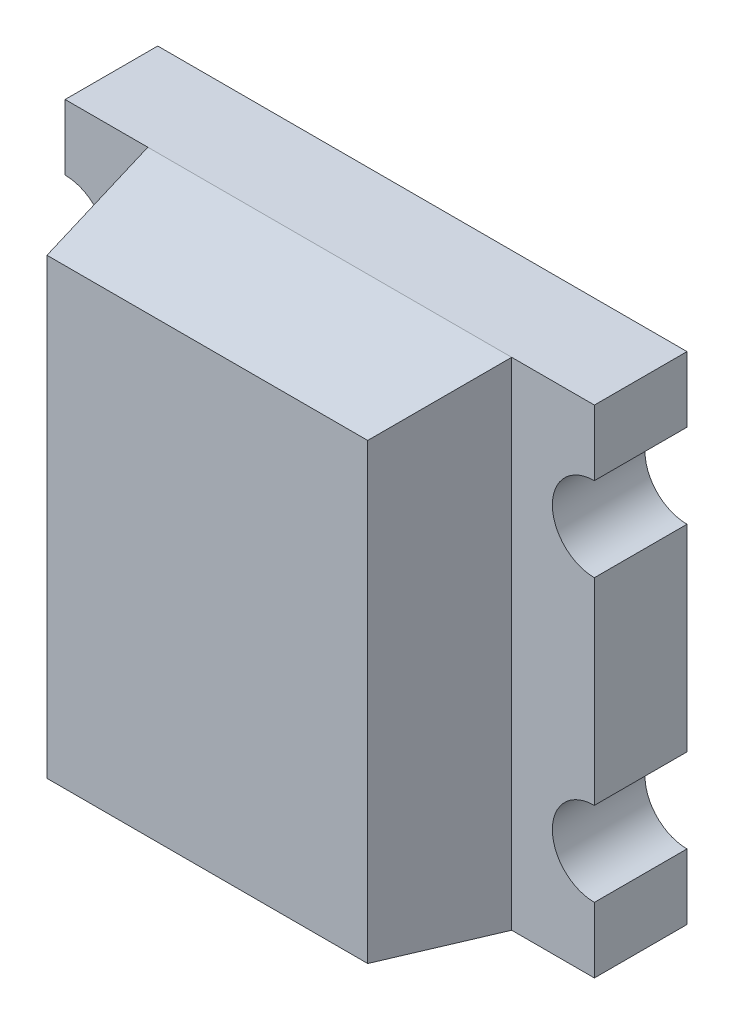
ISO-10303-21;
HEADER;
FILE_DESCRIPTION(('STEP AP214'),'2;1');
FILE_NAME('part.step','',(''),(''),'','','');
FILE_SCHEMA(('AUTOMOTIVE_DESIGN { 1 0 10303 214 1 1 1 1 }'));
ENDSEC;
DATA;
#1=APPLICATION_CONTEXT('core data for automotive mechanical design processes');
#2=APPLICATION_PROTOCOL_DEFINITION('international standard','automotive_design',2000,#1);
#3=PRODUCT_CONTEXT('',#1,'mechanical');
#4=PRODUCT('Part','Part','',(#3));
#5=PRODUCT_RELATED_PRODUCT_CATEGORY('part','',(#4));
#6=PRODUCT_DEFINITION_FORMATION('','',#4);
#7=PRODUCT_DEFINITION_CONTEXT('part definition',#1,'design');
#8=PRODUCT_DEFINITION('design','',#6,#7);
#9=PRODUCT_DEFINITION_SHAPE('','',#8);
#10=(LENGTH_UNIT() NAMED_UNIT(*) SI_UNIT(.MILLI.,.METRE.));
#11=(NAMED_UNIT(*) PLANE_ANGLE_UNIT() SI_UNIT($,.RADIAN.));
#12=(NAMED_UNIT(*) SI_UNIT($,.STERADIAN.) SOLID_ANGLE_UNIT());
#13=UNCERTAINTY_MEASURE_WITH_UNIT(LENGTH_MEASURE(1.E-05),#10,'distance_accuracy_value','');
#14=(GEOMETRIC_REPRESENTATION_CONTEXT(3) GLOBAL_UNCERTAINTY_ASSIGNED_CONTEXT((#13)) GLOBAL_UNIT_ASSIGNED_CONTEXT((#10,
#11,#12)) REPRESENTATION_CONTEXT('',''));
#15=CARTESIAN_POINT('',(0.,0.,0.));
#16=DIRECTION('',(0.,0.,1.));
#17=DIRECTION('',(1.,0.,0.));
#18=AXIS2_PLACEMENT_3D('',#15,#16,#17);
#19=CARTESIAN_POINT('',(-0.8,-0.425,0.));
#20=DIRECTION('',(0.,0.,1.));
#21=DIRECTION('',(0.,-1.,0.));
#22=AXIS2_PLACEMENT_3D('',#19,#20,#21);
#23=CYLINDRICAL_SURFACE('',#22,0.127);
#24=CARTESIAN_POINT('',(-0.8,-0.425,0.));
#25=DIRECTION('',(0.,0.,1.));
#26=DIRECTION('',(0.,-1.,0.));
#27=AXIS2_PLACEMENT_3D('',#24,#25,#26);
#28=CIRCLE('',#27,0.127);
#29=CARTESIAN_POINT('',(-0.8,-0.552,0.));
#30=VERTEX_POINT('',#29);
#31=CARTESIAN_POINT('',(-0.8,-0.298,0.));
#32=VERTEX_POINT('',#31);
#33=EDGE_CURVE('P0_E11',#30,#32,#28,.T.);
#34=ORIENTED_EDGE('',*,*,#33,.F.);
#35=DIRECTION('',(0.,0.,1.));
#36=VECTOR('',#35,1.);
#37=CARTESIAN_POINT('',(-0.8,-0.552,0.));
#38=LINE('',#37,#36);
#39=CARTESIAN_POINT('',(-0.8,-0.552,0.28));
#40=VERTEX_POINT('',#39);
#41=EDGE_CURVE('P0_E23',#30,#40,#38,.T.);
#42=ORIENTED_EDGE('',*,*,#41,.T.);
#43=CARTESIAN_POINT('',(-0.8,-0.425,0.28));
#44=DIRECTION('',(0.,0.,-1.));
#45=DIRECTION('',(0.,-1.,0.));
#46=AXIS2_PLACEMENT_3D('',#43,#44,#45);
#47=CIRCLE('',#46,0.127);
#48=CARTESIAN_POINT('',(-0.8,-0.298,0.28));
#49=VERTEX_POINT('',#48);
#50=EDGE_CURVE('P0_E123',#49,#40,#47,.T.);
#51=ORIENTED_EDGE('',*,*,#50,.F.);
#52=DIRECTION('',(0.,0.,1.));
#53=VECTOR('',#52,1.);
#54=CARTESIAN_POINT('',(-0.8,-0.298,0.));
#55=LINE('',#54,#53);
#56=EDGE_CURVE('P0_E36',#32,#49,#55,.T.);
#57=ORIENTED_EDGE('',*,*,#56,.F.);
#58=EDGE_LOOP('',(#34,#42,#51,#57));
#59=FACE_BOUND('',#58,.T.);
#60=ADVANCED_FACE('P0_F16',(#59),#23,.F.);
#61=CARTESIAN_POINT('',(-0.8,0.298,0.));
#62=DIRECTION('',(-1.,0.,0.));
#63=DIRECTION('',(0.,-1.,0.));
#64=AXIS2_PLACEMENT_3D('',#61,#62,#63);
#65=PLANE('',#64);
#66=DIRECTION('',(0.,-1.,0.));
#67=VECTOR('',#66,1.);
#68=CARTESIAN_POINT('',(-0.8,0.75,0.));
#69=LINE('',#68,#67);
#70=CARTESIAN_POINT('',(-0.8,0.298,0.));
#71=VERTEX_POINT('',#70);
#72=EDGE_CURVE('P0_E198',#71,#32,#69,.T.);
#73=ORIENTED_EDGE('',*,*,#72,.T.);
#74=ORIENTED_EDGE('',*,*,#56,.T.);
#75=DIRECTION('',(0.,-1.,0.));
#76=VECTOR('',#75,1.);
#77=CARTESIAN_POINT('',(-0.8,0.75,0.28));
#78=LINE('',#77,#76);
#79=CARTESIAN_POINT('',(-0.8,0.298,0.28));
#80=VERTEX_POINT('',#79);
#81=EDGE_CURVE('P0_E196',#80,#49,#78,.T.);
#82=ORIENTED_EDGE('',*,*,#81,.F.);
#83=DIRECTION('',(0.,0.,1.));
#84=VECTOR('',#83,1.);
#85=CARTESIAN_POINT('',(-0.8,0.298,0.));
#86=LINE('',#85,#84);
#87=EDGE_CURVE('P0_E193',#71,#80,#86,.T.);
#88=ORIENTED_EDGE('',*,*,#87,.F.);
#89=EDGE_LOOP('',(#73,#74,#82,#88));
#90=FACE_BOUND('',#89,.T.);
#91=ADVANCED_FACE('P0_F234',(#90),#65,.T.);
#92=CARTESIAN_POINT('',(-0.8,0.425,0.));
#93=DIRECTION('',(0.,0.,1.));
#94=DIRECTION('',(0.,-1.,0.));
#95=AXIS2_PLACEMENT_3D('',#92,#93,#94);
#96=CYLINDRICAL_SURFACE('',#95,0.127);
#97=CARTESIAN_POINT('',(-0.8,0.425,0.));
#98=DIRECTION('',(0.,0.,1.));
#99=DIRECTION('',(0.,-1.,0.));
#100=AXIS2_PLACEMENT_3D('',#97,#98,#99);
#101=CIRCLE('',#100,0.127);
#102=CARTESIAN_POINT('',(-0.8,0.552,0.));
#103=VERTEX_POINT('',#102);
#104=EDGE_CURVE('P0_E190',#71,#103,#101,.T.);
#105=ORIENTED_EDGE('',*,*,#104,.F.);
#106=ORIENTED_EDGE('',*,*,#87,.T.);
#107=CARTESIAN_POINT('',(-0.8,0.425,0.28));
#108=DIRECTION('',(0.,0.,-1.));
#109=DIRECTION('',(0.,-1.,0.));
#110=AXIS2_PLACEMENT_3D('',#107,#108,#109);
#111=CIRCLE('',#110,0.127);
#112=CARTESIAN_POINT('',(-0.8,0.552,0.28));
#113=VERTEX_POINT('',#112);
#114=EDGE_CURVE('P0_E187',#113,#80,#111,.T.);
#115=ORIENTED_EDGE('',*,*,#114,.F.);
#116=DIRECTION('',(0.,0.,1.));
#117=VECTOR('',#116,1.);
#118=CARTESIAN_POINT('',(-0.8,0.552,0.));
#119=LINE('',#118,#117);
#120=EDGE_CURVE('P0_E185',#103,#113,#119,.T.);
#121=ORIENTED_EDGE('',*,*,#120,.F.);
#122=EDGE_LOOP('',(#105,#106,#115,#121));
#123=FACE_BOUND('',#122,.T.);
#124=ADVANCED_FACE('P0_F231',(#123),#96,.F.);
#125=CARTESIAN_POINT('',(-0.8,0.75,0.));
#126=DIRECTION('',(-1.,0.,0.));
#127=DIRECTION('',(0.,-1.,0.));
#128=AXIS2_PLACEMENT_3D('',#125,#126,#127);
#129=PLANE('',#128);
#130=DIRECTION('',(0.,-1.,0.));
#131=VECTOR('',#130,1.);
#132=CARTESIAN_POINT('',(-0.8,0.75,0.));
#133=LINE('',#132,#131);
#134=CARTESIAN_POINT('',(-0.8,0.75,0.));
#135=VERTEX_POINT('',#134);
#136=EDGE_CURVE('P0_E182',#135,#103,#133,.T.);
#137=ORIENTED_EDGE('',*,*,#136,.T.);
#138=ORIENTED_EDGE('',*,*,#120,.T.);
#139=DIRECTION('',(0.,-1.,0.));
#140=VECTOR('',#139,1.);
#141=CARTESIAN_POINT('',(-0.8,0.75,0.28));
#142=LINE('',#141,#140);
#143=CARTESIAN_POINT('',(-0.8,0.75,0.28));
#144=VERTEX_POINT('',#143);
#145=EDGE_CURVE('P0_E179',#144,#113,#142,.T.);
#146=ORIENTED_EDGE('',*,*,#145,.F.);
#147=DIRECTION('',(0.,0.,1.));
#148=VECTOR('',#147,1.);
#149=CARTESIAN_POINT('',(-0.8,0.75,0.));
#150=LINE('',#149,#148);
#151=EDGE_CURVE('P0_E176',#135,#144,#150,.T.);
#152=ORIENTED_EDGE('',*,*,#151,.F.);
#153=EDGE_LOOP('',(#137,#138,#146,#152));
#154=FACE_BOUND('',#153,.T.);
#155=ADVANCED_FACE('P0_F228',(#154),#129,.T.);
#156=CARTESIAN_POINT('',(0.8,0.75,0.));
#157=DIRECTION('',(0.,1.,0.));
#158=DIRECTION('',(-1.,0.,0.));
#159=AXIS2_PLACEMENT_3D('',#156,#157,#158);
#160=PLANE('',#159);
#161=DIRECTION('',(-1.,0.,0.));
#162=VECTOR('',#161,1.);
#163=CARTESIAN_POINT('',(0.8,0.75,0.));
#164=LINE('',#163,#162);
#165=CARTESIAN_POINT('',(0.8,0.75,0.));
#166=VERTEX_POINT('',#165);
#167=EDGE_CURVE('P0_E173',#166,#135,#164,.T.);
#168=ORIENTED_EDGE('',*,*,#167,.T.);
#169=ORIENTED_EDGE('',*,*,#151,.T.);
#170=DIRECTION('',(-1.,0.,0.));
#171=VECTOR('',#170,1.);
#172=CARTESIAN_POINT('',(0.8,0.75,0.28));
#173=LINE('',#172,#171);
#174=CARTESIAN_POINT('',(0.8,0.75,0.28));
#175=VERTEX_POINT('',#174);
#176=EDGE_CURVE('P0_E170',#175,#144,#173,.T.);
#177=ORIENTED_EDGE('',*,*,#176,.F.);
#178=DIRECTION('',(0.,0.,1.));
#179=VECTOR('',#178,1.);
#180=CARTESIAN_POINT('',(0.8,0.75,0.));
#181=LINE('',#180,#179);
#182=EDGE_CURVE('P0_E167',#166,#175,#181,.T.);
#183=ORIENTED_EDGE('',*,*,#182,.F.);
#184=EDGE_LOOP('',(#168,#169,#177,#183));
#185=FACE_BOUND('',#184,.T.);
#186=ADVANCED_FACE('P0_F224',(#185),#160,.T.);
#187=CARTESIAN_POINT('',(0.8,0.552,0.));
#188=DIRECTION('',(1.,0.,0.));
#189=DIRECTION('',(0.,1.,0.));
#190=AXIS2_PLACEMENT_3D('',#187,#188,#189);
#191=PLANE('',#190);
#192=DIRECTION('',(0.,1.,0.));
#193=VECTOR('',#192,1.);
#194=CARTESIAN_POINT('',(0.8,-0.75,0.));
#195=LINE('',#194,#193);
#196=CARTESIAN_POINT('',(0.8,0.552,0.));
#197=VERTEX_POINT('',#196);
#198=EDGE_CURVE('P0_E164',#197,#166,#195,.T.);
#199=ORIENTED_EDGE('',*,*,#198,.T.);
#200=ORIENTED_EDGE('',*,*,#182,.T.);
#201=DIRECTION('',(0.,1.,0.));
#202=VECTOR('',#201,1.);
#203=CARTESIAN_POINT('',(0.8,-0.75,0.28));
#204=LINE('',#203,#202);
#205=CARTESIAN_POINT('',(0.8,0.552,0.28));
#206=VERTEX_POINT('',#205);
#207=EDGE_CURVE('P0_E161',#206,#175,#204,.T.);
#208=ORIENTED_EDGE('',*,*,#207,.F.);
#209=DIRECTION('',(0.,0.,1.));
#210=VECTOR('',#209,1.);
#211=CARTESIAN_POINT('',(0.8,0.552,0.));
#212=LINE('',#211,#210);
#213=EDGE_CURVE('P0_E159',#197,#206,#212,.T.);
#214=ORIENTED_EDGE('',*,*,#213,.F.);
#215=EDGE_LOOP('',(#199,#200,#208,#214));
#216=FACE_BOUND('',#215,.T.);
#217=ADVANCED_FACE('P0_F220',(#216),#191,.T.);
#218=CARTESIAN_POINT('',(0.8,0.425,0.));
#219=DIRECTION('',(0.,0.,1.));
#220=DIRECTION('',(0.,1.,0.));
#221=AXIS2_PLACEMENT_3D('',#218,#219,#220);
#222=CYLINDRICAL_SURFACE('',#221,0.127);
#223=CARTESIAN_POINT('',(0.8,0.425,0.));
#224=DIRECTION('',(0.,0.,1.));
#225=DIRECTION('',(0.,1.,0.));
#226=AXIS2_PLACEMENT_3D('',#223,#224,#225);
#227=CIRCLE('',#226,0.127);
#228=CARTESIAN_POINT('',(0.8,0.298,0.));
#229=VERTEX_POINT('',#228);
#230=EDGE_CURVE('P0_E156',#197,#229,#227,.T.);
#231=ORIENTED_EDGE('',*,*,#230,.F.);
#232=ORIENTED_EDGE('',*,*,#213,.T.);
#233=CARTESIAN_POINT('',(0.8,0.425,0.28));
#234=DIRECTION('',(0.,0.,-1.));
#235=DIRECTION('',(0.,1.,0.));
#236=AXIS2_PLACEMENT_3D('',#233,#234,#235);
#237=CIRCLE('',#236,0.127);
#238=CARTESIAN_POINT('',(0.8,0.298,0.28));
#239=VERTEX_POINT('',#238);
#240=EDGE_CURVE('P0_E153',#239,#206,#237,.T.);
#241=ORIENTED_EDGE('',*,*,#240,.F.);
#242=DIRECTION('',(0.,0.,1.));
#243=VECTOR('',#242,1.);
#244=CARTESIAN_POINT('',(0.8,0.298,0.));
#245=LINE('',#244,#243);
#246=EDGE_CURVE('P0_E151',#229,#239,#245,.T.);
#247=ORIENTED_EDGE('',*,*,#246,.F.);
#248=EDGE_LOOP('',(#231,#232,#241,#247));
#249=FACE_BOUND('',#248,.T.);
#250=ADVANCED_FACE('P0_F217',(#249),#222,.F.);
#251=CARTESIAN_POINT('',(0.8,-0.298,0.));
#252=DIRECTION('',(1.,0.,0.));
#253=DIRECTION('',(0.,1.,0.));
#254=AXIS2_PLACEMENT_3D('',#251,#252,#253);
#255=PLANE('',#254);
#256=DIRECTION('',(0.,1.,0.));
#257=VECTOR('',#256,1.);
#258=CARTESIAN_POINT('',(0.8,-0.75,0.));
#259=LINE('',#258,#257);
#260=CARTESIAN_POINT('',(0.8,-0.298,0.));
#261=VERTEX_POINT('',#260);
#262=EDGE_CURVE('P0_E148',#261,#229,#259,.T.);
#263=ORIENTED_EDGE('',*,*,#262,.T.);
#264=ORIENTED_EDGE('',*,*,#246,.T.);
#265=DIRECTION('',(0.,1.,0.));
#266=VECTOR('',#265,1.);
#267=CARTESIAN_POINT('',(0.8,-0.75,0.28));
#268=LINE('',#267,#266);
#269=CARTESIAN_POINT('',(0.8,-0.298,0.28));
#270=VERTEX_POINT('',#269);
#271=EDGE_CURVE('P0_E145',#270,#239,#268,.T.);
#272=ORIENTED_EDGE('',*,*,#271,.F.);
#273=DIRECTION('',(0.,0.,1.));
#274=VECTOR('',#273,1.);
#275=CARTESIAN_POINT('',(0.8,-0.298,0.));
#276=LINE('',#275,#274);
#277=EDGE_CURVE('P0_E142',#261,#270,#276,.T.);
#278=ORIENTED_EDGE('',*,*,#277,.F.);
#279=EDGE_LOOP('',(#263,#264,#272,#278));
#280=FACE_BOUND('',#279,.T.);
#281=ADVANCED_FACE('P0_F213',(#280),#255,.T.);
#282=CARTESIAN_POINT('',(0.8,-0.425,0.));
#283=DIRECTION('',(0.,0.,1.));
#284=DIRECTION('',(0.,1.,0.));
#285=AXIS2_PLACEMENT_3D('',#282,#283,#284);
#286=CYLINDRICAL_SURFACE('',#285,0.127);
#287=CARTESIAN_POINT('',(0.8,-0.425,0.));
#288=DIRECTION('',(0.,0.,1.));
#289=DIRECTION('',(0.,1.,0.));
#290=AXIS2_PLACEMENT_3D('',#287,#288,#289);
#291=CIRCLE('',#290,0.127);
#292=CARTESIAN_POINT('',(0.8,-0.552,0.));
#293=VERTEX_POINT('',#292);
#294=EDGE_CURVE('P0_E139',#261,#293,#291,.T.);
#295=ORIENTED_EDGE('',*,*,#294,.F.);
#296=ORIENTED_EDGE('',*,*,#277,.T.);
#297=CARTESIAN_POINT('',(0.8,-0.425,0.28));
#298=DIRECTION('',(0.,0.,-1.));
#299=DIRECTION('',(0.,1.,0.));
#300=AXIS2_PLACEMENT_3D('',#297,#298,#299);
#301=CIRCLE('',#300,0.127);
#302=CARTESIAN_POINT('',(0.8,-0.552,0.28));
#303=VERTEX_POINT('',#302);
#304=EDGE_CURVE('P0_E136',#303,#270,#301,.T.);
#305=ORIENTED_EDGE('',*,*,#304,.F.);
#306=DIRECTION('',(0.,0.,1.));
#307=VECTOR('',#306,1.);
#308=CARTESIAN_POINT('',(0.8,-0.552,0.));
#309=LINE('',#308,#307);
#310=EDGE_CURVE('P0_E134',#293,#303,#309,.T.);
#311=ORIENTED_EDGE('',*,*,#310,.F.);
#312=EDGE_LOOP('',(#295,#296,#305,#311));
#313=FACE_BOUND('',#312,.T.);
#314=ADVANCED_FACE('P0_F210',(#313),#286,.F.);
#315=CARTESIAN_POINT('',(0.8,-0.75,0.));
#316=DIRECTION('',(1.,0.,0.));
#317=DIRECTION('',(0.,1.,0.));
#318=AXIS2_PLACEMENT_3D('',#315,#316,#317);
#319=PLANE('',#318);
#320=DIRECTION('',(0.,1.,0.));
#321=VECTOR('',#320,1.);
#322=CARTESIAN_POINT('',(0.8,-0.75,0.));
#323=LINE('',#322,#321);
#324=CARTESIAN_POINT('',(0.8,-0.75,0.));
#325=VERTEX_POINT('',#324);
#326=EDGE_CURVE('P0_E131',#325,#293,#323,.T.);
#327=ORIENTED_EDGE('',*,*,#326,.T.);
#328=ORIENTED_EDGE('',*,*,#310,.T.);
#329=DIRECTION('',(0.,1.,0.));
#330=VECTOR('',#329,1.);
#331=CARTESIAN_POINT('',(0.8,-0.75,0.28));
#332=LINE('',#331,#330);
#333=CARTESIAN_POINT('',(0.8,-0.75,0.28));
#334=VERTEX_POINT('',#333);
#335=EDGE_CURVE('P0_E129',#334,#303,#332,.T.);
#336=ORIENTED_EDGE('',*,*,#335,.F.);
#337=DIRECTION('',(0.,0.,1.));
#338=VECTOR('',#337,1.);
#339=CARTESIAN_POINT('',(0.8,-0.75,0.));
#340=LINE('',#339,#338);
#341=EDGE_CURVE('P0_E109',#325,#334,#340,.T.);
#342=ORIENTED_EDGE('',*,*,#341,.F.);
#343=EDGE_LOOP('',(#327,#328,#336,#342));
#344=FACE_BOUND('',#343,.T.);
#345=ADVANCED_FACE('P0_F207',(#344),#319,.T.);
#346=CARTESIAN_POINT('',(-0.8,-0.75,0.));
#347=DIRECTION('',(0.,-1.,0.));
#348=DIRECTION('',(1.,0.,0.));
#349=AXIS2_PLACEMENT_3D('',#346,#347,#348);
#350=PLANE('',#349);
#351=DIRECTION('',(1.,0.,0.));
#352=VECTOR('',#351,1.);
#353=CARTESIAN_POINT('',(-0.8,-0.75,0.));
#354=LINE('',#353,#352);
#355=CARTESIAN_POINT('',(-0.8,-0.75,0.));
#356=VERTEX_POINT('',#355);
#357=EDGE_CURVE('P0_E114',#356,#325,#354,.T.);
#358=ORIENTED_EDGE('',*,*,#357,.T.);
#359=ORIENTED_EDGE('',*,*,#341,.T.);
#360=DIRECTION('',(1.,0.,0.));
#361=VECTOR('',#360,1.);
#362=CARTESIAN_POINT('',(-0.8,-0.75,0.28));
#363=LINE('',#362,#361);
#364=CARTESIAN_POINT('',(-0.8,-0.75,0.28));
#365=VERTEX_POINT('',#364);
#366=EDGE_CURVE('P0_E104',#365,#334,#363,.T.);
#367=ORIENTED_EDGE('',*,*,#366,.F.);
#368=DIRECTION('',(0.,0.,1.));
#369=VECTOR('',#368,1.);
#370=CARTESIAN_POINT('',(-0.8,-0.75,0.));
#371=LINE('',#370,#369);
#372=EDGE_CURVE('P0_E107',#356,#365,#371,.T.);
#373=ORIENTED_EDGE('',*,*,#372,.F.);
#374=EDGE_LOOP('',(#358,#359,#367,#373));
#375=FACE_BOUND('',#374,.T.);
#376=ADVANCED_FACE('P0_F106',(#375),#350,.T.);
#377=CARTESIAN_POINT('',(-0.8,-0.552,0.));
#378=DIRECTION('',(-1.,0.,0.));
#379=DIRECTION('',(0.,-1.,0.));
#380=AXIS2_PLACEMENT_3D('',#377,#378,#379);
#381=PLANE('',#380);
#382=DIRECTION('',(0.,-1.,0.));
#383=VECTOR('',#382,1.);
#384=CARTESIAN_POINT('',(-0.8,0.75,0.));
#385=LINE('',#384,#383);
#386=EDGE_CURVE('P0_E119',#30,#356,#385,.T.);
#387=ORIENTED_EDGE('',*,*,#386,.T.);
#388=ORIENTED_EDGE('',*,*,#372,.T.);
#389=DIRECTION('',(0.,-1.,0.));
#390=VECTOR('',#389,1.);
#391=CARTESIAN_POINT('',(-0.8,0.75,0.28));
#392=LINE('',#391,#390);
#393=EDGE_CURVE('P0_E117',#40,#365,#392,.T.);
#394=ORIENTED_EDGE('',*,*,#393,.F.);
#395=ORIENTED_EDGE('',*,*,#41,.F.);
#396=EDGE_LOOP('',(#387,#388,#394,#395));
#397=FACE_BOUND('',#396,.T.);
#398=ADVANCED_FACE('P0_F116',(#397),#381,.T.);
#399=CARTESIAN_POINT('',(0.,0.,0.28));
#400=DIRECTION('',(0.,0.,1.));
#401=DIRECTION('',(1.,0.,0.));
#402=AXIS2_PLACEMENT_3D('',#399,#400,#401);
#403=PLANE('',#402);
#404=ORIENTED_EDGE('',*,*,#393,.T.);
#405=ORIENTED_EDGE('',*,*,#366,.T.);
#406=ORIENTED_EDGE('',*,*,#335,.T.);
#407=ORIENTED_EDGE('',*,*,#304,.T.);
#408=ORIENTED_EDGE('',*,*,#271,.T.);
#409=ORIENTED_EDGE('',*,*,#240,.T.);
#410=ORIENTED_EDGE('',*,*,#207,.T.);
#411=ORIENTED_EDGE('',*,*,#176,.T.);
#412=ORIENTED_EDGE('',*,*,#145,.T.);
#413=ORIENTED_EDGE('',*,*,#114,.T.);
#414=ORIENTED_EDGE('',*,*,#81,.T.);
#415=ORIENTED_EDGE('',*,*,#50,.T.);
#416=EDGE_LOOP('',(#404,#405,#406,#407,#408,#409,#410,#411,#412,#413,#414,#415));
#417=FACE_BOUND('',#416,.T.);
#418=ADVANCED_FACE('P0_F121',(#417),#403,.T.);
#419=CARTESIAN_POINT('',(0.,0.,0.));
#420=DIRECTION('',(0.,0.,1.));
#421=DIRECTION('',(1.,0.,0.));
#422=AXIS2_PLACEMENT_3D('',#419,#420,#421);
#423=PLANE('',#422);
#424=ORIENTED_EDGE('',*,*,#386,.F.);
#425=ORIENTED_EDGE('',*,*,#33,.T.);
#426=ORIENTED_EDGE('',*,*,#72,.F.);
#427=ORIENTED_EDGE('',*,*,#104,.T.);
#428=ORIENTED_EDGE('',*,*,#136,.F.);
#429=ORIENTED_EDGE('',*,*,#167,.F.);
#430=ORIENTED_EDGE('',*,*,#198,.F.);
#431=ORIENTED_EDGE('',*,*,#230,.T.);
#432=ORIENTED_EDGE('',*,*,#262,.F.);
#433=ORIENTED_EDGE('',*,*,#294,.T.);
#434=ORIENTED_EDGE('',*,*,#326,.F.);
#435=ORIENTED_EDGE('',*,*,#357,.F.);
#436=EDGE_LOOP('',(#424,#425,#426,#427,#428,#429,#430,#431,#432,#433,#434,#435));
#437=FACE_BOUND('',#436,.T.);
#438=ADVANCED_FACE('P0_F203',(#437),#423,.F.);
#439=CLOSED_SHELL('',(#60,#91,#124,#155,#186,#217,#250,#281,#314,#345,#376,#398,#418,#438));
#440=MANIFOLD_SOLID_BREP('P0_B1',#439);
#441=CARTESIAN_POINT('',(0.55,0.75,0.28));
#442=DIRECTION('',(0.984807753012208,0.,0.17364817766693));
#443=DIRECTION('',(0.,1.,0.));
#444=AXIS2_PLACEMENT_3D('',#441,#442,#443);
#445=PLANE('',#444);
#446=DIRECTION('',(0.,-1.,0.));
#447=VECTOR('',#446,1.);
#448=CARTESIAN_POINT('',(0.484759017137868,0.711060167488243,0.65));
#449=LINE('',#448,#447);
#450=CARTESIAN_POINT('',(0.484759017137868,0.684759017137868,0.65));
#451=VERTEX_POINT('',#450);
#452=CARTESIAN_POINT('',(0.484759017137868,-0.684759017137868,0.65));
#453=VERTEX_POINT('',#452);
#454=EDGE_CURVE('P1_E11',#451,#453,#449,.T.);
#455=ORIENTED_EDGE('',*,*,#454,.T.);
#456=DIRECTION('',(-0.171087869746036,0.171087869746035,0.970287525247814));
#457=VECTOR('',#456,1.);
#458=CARTESIAN_POINT('',(0.528046705619323,-0.728046705619323,0.404503319301851));
#459=LINE('',#458,#457);
#460=CARTESIAN_POINT('',(0.55,-0.75,0.28));
#461=VERTEX_POINT('',#460);
#462=EDGE_CURVE('P1_E23',#461,#453,#459,.T.);
#463=ORIENTED_EDGE('',*,*,#462,.F.);
#464=DIRECTION('',(0.,-1.,0.));
#465=VECTOR('',#464,1.);
#466=CARTESIAN_POINT('',(0.55,0.711060167488243,0.28));
#467=LINE('',#466,#465);
#468=CARTESIAN_POINT('',(0.55,0.75,0.28));
#469=VERTEX_POINT('',#468);
#470=EDGE_CURVE('P1_E87',#469,#461,#467,.T.);
#471=ORIENTED_EDGE('',*,*,#470,.F.);
#472=DIRECTION('',(-0.171087869746036,-0.171087869746035,0.970287525247814));
#473=VECTOR('',#472,1.);
#474=CARTESIAN_POINT('',(0.53390091745417,0.73390091745417,0.371302434154691));
#475=LINE('',#474,#473);
#476=EDGE_CURVE('P1_E76',#469,#451,#475,.T.);
#477=ORIENTED_EDGE('',*,*,#476,.T.);
#478=EDGE_LOOP('',(#455,#463,#471,#477));
#479=FACE_BOUND('',#478,.T.);
#480=ADVANCED_FACE('P1_F16',(#479),#445,.T.);
#481=CARTESIAN_POINT('',(0.55,-0.75,0.28));
#482=DIRECTION('',(0.,-0.984807753012208,0.17364817766693));
#483=DIRECTION('',(1.,0.,0.));
#484=AXIS2_PLACEMENT_3D('',#481,#482,#483);
#485=PLANE('',#484);
#486=DIRECTION('',(-1.,0.,0.));
#487=VECTOR('',#486,1.);
#488=CARTESIAN_POINT('',(-0.8,-0.684759017137868,0.65));
#489=LINE('',#488,#487);
#490=CARTESIAN_POINT('',(-0.484759017137868,-0.684759017137868,0.65));
#491=VERTEX_POINT('',#490);
#492=EDGE_CURVE('P1_E84',#453,#491,#489,.T.);
#493=ORIENTED_EDGE('',*,*,#492,.T.);
#494=DIRECTION('',(0.171087869746036,0.171087869746035,0.970287525247814));
#495=VECTOR('',#494,1.);
#496=CARTESIAN_POINT('',(-0.53390091745417,-0.73390091745417,0.371302434154691));
#497=LINE('',#496,#495);
#498=CARTESIAN_POINT('',(-0.55,-0.75,0.28));
#499=VERTEX_POINT('',#498);
#500=EDGE_CURVE('P1_E82',#499,#491,#497,.T.);
#501=ORIENTED_EDGE('',*,*,#500,.F.);
#502=DIRECTION('',(1.,0.,0.));
#503=VECTOR('',#502,1.);
#504=CARTESIAN_POINT('',(-0.8,-0.75,0.28));
#505=LINE('',#504,#503);
#506=EDGE_CURVE('P1_E71',#499,#461,#505,.T.);
#507=ORIENTED_EDGE('',*,*,#506,.T.);
#508=ORIENTED_EDGE('',*,*,#462,.T.);
#509=EDGE_LOOP('',(#493,#501,#507,#508));
#510=FACE_BOUND('',#509,.T.);
#511=ADVANCED_FACE('P1_F89',(#510),#485,.T.);
#512=CARTESIAN_POINT('',(-0.55,-0.75,0.28));
#513=DIRECTION('',(-0.984807753012208,0.,0.17364817766693));
#514=DIRECTION('',(0.,-1.,0.));
#515=AXIS2_PLACEMENT_3D('',#512,#513,#514);
#516=PLANE('',#515);
#517=DIRECTION('',(0.,1.,0.));
#518=VECTOR('',#517,1.);
#519=CARTESIAN_POINT('',(-0.484759017137868,0.75,0.65));
#520=LINE('',#519,#518);
#521=CARTESIAN_POINT('',(-0.484759017137868,0.684759017137868,0.65));
#522=VERTEX_POINT('',#521);
#523=EDGE_CURVE('P1_E59',#491,#522,#520,.T.);
#524=ORIENTED_EDGE('',*,*,#523,.T.);
#525=DIRECTION('',(0.171087869746036,-0.171087869746035,0.970287525247814));
#526=VECTOR('',#525,1.);
#527=CARTESIAN_POINT('',(-0.528046705619323,0.728046705619323,0.404503319301851));
#528=LINE('',#527,#526);
#529=CARTESIAN_POINT('',(-0.55,0.75,0.28));
#530=VERTEX_POINT('',#529);
#531=EDGE_CURVE('P1_E53',#530,#522,#528,.T.);
#532=ORIENTED_EDGE('',*,*,#531,.F.);
#533=DIRECTION('',(0.,-1.,0.));
#534=VECTOR('',#533,1.);
#535=CARTESIAN_POINT('',(-0.55,0.75,0.28));
#536=LINE('',#535,#534);
#537=EDGE_CURVE('P1_E57',#530,#499,#536,.T.);
#538=ORIENTED_EDGE('',*,*,#537,.T.);
#539=ORIENTED_EDGE('',*,*,#500,.T.);
#540=EDGE_LOOP('',(#524,#532,#538,#539));
#541=FACE_BOUND('',#540,.T.);
#542=ADVANCED_FACE('P1_F55',(#541),#516,.T.);
#543=CARTESIAN_POINT('',(-0.55,0.75,0.28));
#544=DIRECTION('',(0.,0.984807753012208,0.17364817766693));
#545=DIRECTION('',(-1.,0.,0.));
#546=AXIS2_PLACEMENT_3D('',#543,#544,#545);
#547=PLANE('',#546);
#548=DIRECTION('',(1.,0.,0.));
#549=VECTOR('',#548,1.);
#550=CARTESIAN_POINT('',(0.8,0.684759017137868,0.65));
#551=LINE('',#550,#549);
#552=EDGE_CURVE('P1_E72',#522,#451,#551,.T.);
#553=ORIENTED_EDGE('',*,*,#552,.T.);
#554=ORIENTED_EDGE('',*,*,#476,.F.);
#555=DIRECTION('',(-1.,0.,0.));
#556=VECTOR('',#555,1.);
#557=CARTESIAN_POINT('',(0.8,0.75,0.28));
#558=LINE('',#557,#556);
#559=EDGE_CURVE('P1_E69',#469,#530,#558,.T.);
#560=ORIENTED_EDGE('',*,*,#559,.T.);
#561=ORIENTED_EDGE('',*,*,#531,.T.);
#562=EDGE_LOOP('',(#553,#554,#560,#561));
#563=FACE_BOUND('',#562,.T.);
#564=ADVANCED_FACE('P1_F75',(#563),#547,.T.);
#565=CARTESIAN_POINT('',(0.,0.,0.65));
#566=DIRECTION('',(0.,0.,1.));
#567=DIRECTION('',(-1.,0.,0.));
#568=AXIS2_PLACEMENT_3D('',#565,#566,#567);
#569=PLANE('',#568);
#570=ORIENTED_EDGE('',*,*,#454,.F.);
#571=ORIENTED_EDGE('',*,*,#552,.F.);
#572=ORIENTED_EDGE('',*,*,#523,.F.);
#573=ORIENTED_EDGE('',*,*,#492,.F.);
#574=EDGE_LOOP('',(#570,#571,#572,#573));
#575=FACE_BOUND('',#574,.T.);
#576=ADVANCED_FACE('P1_F90',(#575),#569,.T.);
#577=CARTESIAN_POINT('',(0.,0.,0.28));
#578=DIRECTION('',(0.,0.,1.));
#579=DIRECTION('',(-1.,0.,0.));
#580=AXIS2_PLACEMENT_3D('',#577,#578,#579);
#581=PLANE('',#580);
#582=ORIENTED_EDGE('',*,*,#559,.F.);
#583=ORIENTED_EDGE('',*,*,#470,.T.);
#584=ORIENTED_EDGE('',*,*,#506,.F.);
#585=ORIENTED_EDGE('',*,*,#537,.F.);
#586=EDGE_LOOP('',(#582,#583,#584,#585));
#587=FACE_BOUND('',#586,.T.);
#588=ADVANCED_FACE('P1_F67',(#587),#581,.F.);
#589=CLOSED_SHELL('',(#480,#511,#542,#564,#576,#588));
#590=MANIFOLD_SOLID_BREP('P1_B1',#589);
#591=ADVANCED_BREP_SHAPE_REPRESENTATION('',(#18,#440,#590),#14);
#592=SHAPE_DEFINITION_REPRESENTATION(#9,#591);
ENDSEC;
END-ISO-10303-21;
